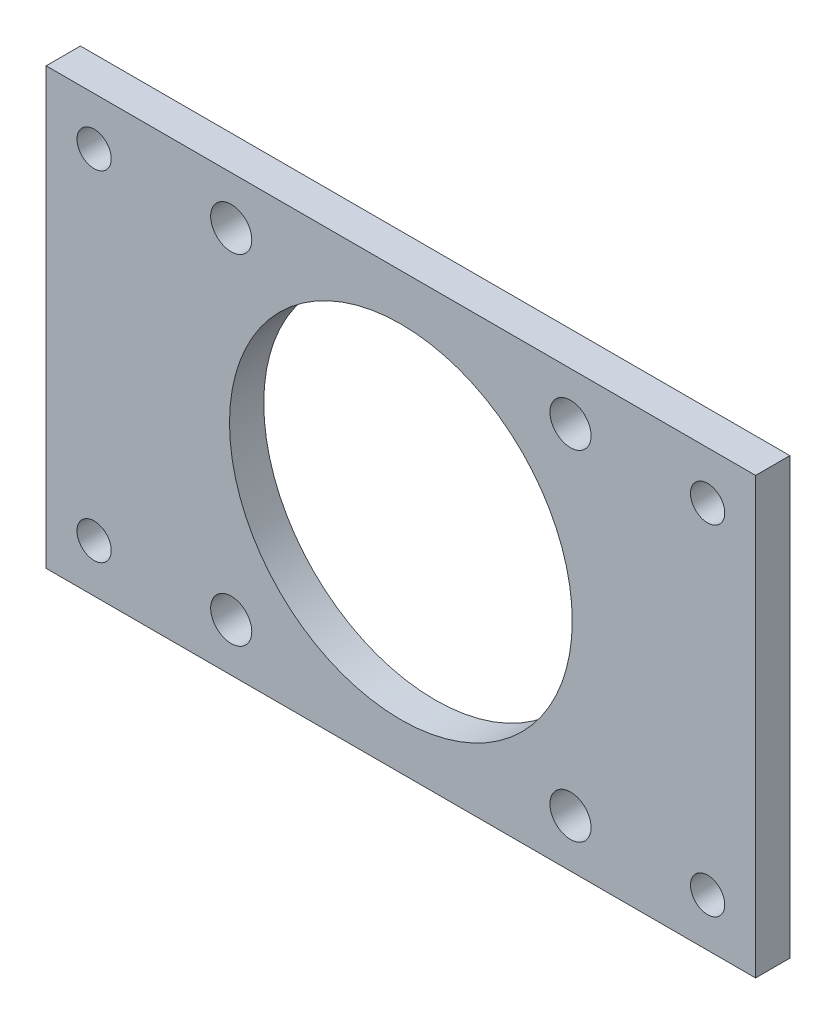
ISO-10303-21;
HEADER;
FILE_DESCRIPTION(('STEP AP214'),'2;1');
FILE_NAME('part.step','',(''),(''),'','','');
FILE_SCHEMA(('AUTOMOTIVE_DESIGN { 1 0 10303 214 1 1 1 1 }'));
ENDSEC;
DATA;
#1=APPLICATION_CONTEXT('core data for automotive mechanical design processes');
#2=APPLICATION_PROTOCOL_DEFINITION('international standard','automotive_design',2000,#1);
#3=PRODUCT_CONTEXT('',#1,'mechanical');
#4=PRODUCT('Part','Part','',(#3));
#5=PRODUCT_RELATED_PRODUCT_CATEGORY('part','',(#4));
#6=PRODUCT_DEFINITION_FORMATION('','',#4);
#7=PRODUCT_DEFINITION_CONTEXT('part definition',#1,'design');
#8=PRODUCT_DEFINITION('design','',#6,#7);
#9=PRODUCT_DEFINITION_SHAPE('','',#8);
#10=(LENGTH_UNIT() NAMED_UNIT(*) SI_UNIT(.MILLI.,.METRE.));
#11=(NAMED_UNIT(*) PLANE_ANGLE_UNIT() SI_UNIT($,.RADIAN.));
#12=(NAMED_UNIT(*) SI_UNIT($,.STERADIAN.) SOLID_ANGLE_UNIT());
#13=UNCERTAINTY_MEASURE_WITH_UNIT(LENGTH_MEASURE(1.E-05),#10,'distance_accuracy_value','');
#14=(GEOMETRIC_REPRESENTATION_CONTEXT(3) GLOBAL_UNCERTAINTY_ASSIGNED_CONTEXT((#13)) GLOBAL_UNIT_ASSIGNED_CONTEXT((#10,
#11,#12)) REPRESENTATION_CONTEXT('',''));
#15=CARTESIAN_POINT('',(0.,0.,0.));
#16=DIRECTION('',(0.,0.,1.));
#17=DIRECTION('',(1.,0.,0.));
#18=AXIS2_PLACEMENT_3D('',#15,#16,#17);
#19=CARTESIAN_POINT('',(0.,0.,5.));
#20=DIRECTION('',(0.,0.,1.));
#21=DIRECTION('',(1.,0.,0.));
#22=AXIS2_PLACEMENT_3D('',#19,#20,#21);
#23=PLANE('',#22);
#24=CARTESIAN_POINT('',(-44.7487373415291,-24.7487373415292,5.));
#25=DIRECTION('',(0.,0.,1.));
#26=DIRECTION('',(1.,0.,0.));
#27=AXIS2_PLACEMENT_3D('',#24,#25,#26);
#28=CIRCLE('',#27,2.49999999999999);
#29=CARTESIAN_POINT('',(-42.2487373415291,-24.7487373415292,5.));
#30=VERTEX_POINT('',#29);
#31=EDGE_CURVE('E182',#30,#30,#28,.T.);
#32=ORIENTED_EDGE('',*,*,#31,.F.);
#33=EDGE_LOOP('',(#32));
#34=FACE_BOUND('',#33,.T.);
#35=CARTESIAN_POINT('',(-24.7487373415289,24.7487373415294,5.));
#36=DIRECTION('',(0.,0.,1.));
#37=DIRECTION('',(1.,0.,0.));
#38=AXIS2_PLACEMENT_3D('',#35,#36,#37);
#39=CIRCLE('',#38,3.);
#40=CARTESIAN_POINT('',(-21.7487373415289,24.7487373415294,5.));
#41=VERTEX_POINT('',#40);
#42=EDGE_CURVE('E166',#41,#41,#39,.T.);
#43=ORIENTED_EDGE('',*,*,#42,.F.);
#44=EDGE_LOOP('',(#43));
#45=FACE_BOUND('',#44,.T.);
#46=CARTESIAN_POINT('',(24.7487373415291,-24.7487373415292,5.));
#47=DIRECTION('',(0.,0.,1.));
#48=DIRECTION('',(1.,0.,0.));
#49=AXIS2_PLACEMENT_3D('',#46,#47,#48);
#50=CIRCLE('',#49,3.);
#51=CARTESIAN_POINT('',(27.7487373415291,-24.7487373415292,5.));
#52=VERTEX_POINT('',#51);
#53=EDGE_CURVE('E150',#52,#52,#50,.T.);
#54=ORIENTED_EDGE('',*,*,#53,.F.);
#55=EDGE_LOOP('',(#54));
#56=FACE_BOUND('',#55,.T.);
#57=CARTESIAN_POINT('',(24.7487373415291,24.7487373415292,5.));
#58=DIRECTION('',(0.,0.,1.));
#59=DIRECTION('',(1.,0.,0.));
#60=AXIS2_PLACEMENT_3D('',#57,#58,#59);
#61=CIRCLE('',#60,3.);
#62=CARTESIAN_POINT('',(27.7487373415291,24.7487373415292,5.));
#63=VERTEX_POINT('',#62);
#64=EDGE_CURVE('E134',#63,#63,#61,.T.);
#65=ORIENTED_EDGE('',*,*,#64,.F.);
#66=EDGE_LOOP('',(#65));
#67=FACE_BOUND('',#66,.T.);
#68=DIRECTION('',(0.,-1.,0.));
#69=VECTOR('',#68,1.);
#70=CARTESIAN_POINT('',(-51.7487373415291,31.7487373415292,5.));
#71=LINE('',#70,#69);
#72=CARTESIAN_POINT('',(-51.7487373415291,31.7487373415292,5.));
#73=VERTEX_POINT('',#72);
#74=CARTESIAN_POINT('',(-51.7487373415291,-31.7487373415292,5.));
#75=VERTEX_POINT('',#74);
#76=EDGE_CURVE('E92',#73,#75,#71,.T.);
#77=ORIENTED_EDGE('',*,*,#76,.T.);
#78=DIRECTION('',(1.,0.,0.));
#79=VECTOR('',#78,1.);
#80=CARTESIAN_POINT('',(-51.7487373415291,-31.7487373415292,5.));
#81=LINE('',#80,#79);
#82=CARTESIAN_POINT('',(51.7487373415291,-31.7487373415292,5.));
#83=VERTEX_POINT('',#82);
#84=EDGE_CURVE('E87',#75,#83,#81,.T.);
#85=ORIENTED_EDGE('',*,*,#84,.T.);
#86=DIRECTION('',(0.,1.,0.));
#87=VECTOR('',#86,1.);
#88=CARTESIAN_POINT('',(51.7487373415291,31.7487373415292,5.));
#89=LINE('',#88,#87);
#90=CARTESIAN_POINT('',(51.7487373415291,31.7487373415292,5.));
#91=VERTEX_POINT('',#90);
#92=EDGE_CURVE('E90',#83,#91,#89,.T.);
#93=ORIENTED_EDGE('',*,*,#92,.T.);
#94=DIRECTION('',(-1.,0.,0.));
#95=VECTOR('',#94,1.);
#96=CARTESIAN_POINT('',(-51.7487373415291,31.7487373415292,5.));
#97=LINE('',#96,#95);
#98=EDGE_CURVE('E57',#91,#73,#97,.T.);
#99=ORIENTED_EDGE('',*,*,#98,.T.);
#100=EDGE_LOOP('',(#77,#85,#93,#99));
#101=FACE_BOUND('',#100,.T.);
#102=CARTESIAN_POINT('',(0.,0.,5.));
#103=DIRECTION('',(0.,0.,1.));
#104=DIRECTION('',(1.,0.,0.));
#105=AXIS2_PLACEMENT_3D('',#102,#103,#104);
#106=CIRCLE('',#105,25.);
#107=CARTESIAN_POINT('',(25.,0.,5.));
#108=VERTEX_POINT('',#107);
#109=EDGE_CURVE('E112',#108,#108,#106,.T.);
#110=ORIENTED_EDGE('',*,*,#109,.F.);
#111=EDGE_LOOP('',(#110));
#112=FACE_BOUND('',#111,.T.);
#113=CARTESIAN_POINT('',(44.7487373415291,24.7487373415292,5.));
#114=DIRECTION('',(0.,0.,1.));
#115=DIRECTION('',(1.,0.,0.));
#116=AXIS2_PLACEMENT_3D('',#113,#114,#115);
#117=CIRCLE('',#116,2.49999999999999);
#118=CARTESIAN_POINT('',(47.2487373415291,24.7487373415292,5.));
#119=VERTEX_POINT('',#118);
#120=EDGE_CURVE('E142',#119,#119,#117,.T.);
#121=ORIENTED_EDGE('',*,*,#120,.F.);
#122=EDGE_LOOP('',(#121));
#123=FACE_BOUND('',#122,.T.);
#124=CARTESIAN_POINT('',(-24.7487373415277,-24.7487373415306,5.));
#125=DIRECTION('',(0.,0.,1.));
#126=DIRECTION('',(1.,0.,0.));
#127=AXIS2_PLACEMENT_3D('',#124,#125,#126);
#128=CIRCLE('',#127,3.00000000000104);
#129=CARTESIAN_POINT('',(-21.7487373415267,-24.7487373415306,5.));
#130=VERTEX_POINT('',#129);
#131=EDGE_CURVE('E158',#130,#130,#128,.T.);
#132=ORIENTED_EDGE('',*,*,#131,.F.);
#133=EDGE_LOOP('',(#132));
#134=FACE_BOUND('',#133,.T.);
#135=CARTESIAN_POINT('',(44.7487373415291,-24.7487373415292,5.));
#136=DIRECTION('',(0.,0.,1.));
#137=DIRECTION('',(-1.,0.,0.));
#138=AXIS2_PLACEMENT_3D('',#135,#136,#137);
#139=CIRCLE('',#138,2.49999999999999);
#140=CARTESIAN_POINT('',(42.2487373415291,-24.7487373415292,5.));
#141=VERTEX_POINT('',#140);
#142=EDGE_CURVE('E174',#141,#141,#139,.T.);
#143=ORIENTED_EDGE('',*,*,#142,.F.);
#144=EDGE_LOOP('',(#143));
#145=FACE_BOUND('',#144,.T.);
#146=CARTESIAN_POINT('',(-44.7487373415291,24.7487373415292,5.));
#147=DIRECTION('',(0.,0.,1.));
#148=DIRECTION('',(-1.,0.,0.));
#149=AXIS2_PLACEMENT_3D('',#146,#147,#148);
#150=CIRCLE('',#149,2.49999999999999);
#151=CARTESIAN_POINT('',(-47.2487373415291,24.7487373415292,5.));
#152=VERTEX_POINT('',#151);
#153=EDGE_CURVE('E190',#152,#152,#150,.T.);
#154=ORIENTED_EDGE('',*,*,#153,.F.);
#155=EDGE_LOOP('',(#154));
#156=FACE_BOUND('',#155,.T.);
#157=ADVANCED_FACE('F39',(#34,#45,#56,#67,#101,#112,#123,#134,#145,#156),#23,.T.);
#158=CARTESIAN_POINT('',(0.,0.,0.));
#159=DIRECTION('',(0.,0.,1.));
#160=DIRECTION('',(1.,0.,0.));
#161=AXIS2_PLACEMENT_3D('',#158,#159,#160);
#162=PLANE('',#161);
#163=DIRECTION('',(0.,-1.,0.));
#164=VECTOR('',#163,1.);
#165=CARTESIAN_POINT('',(-51.7487373415291,31.7487373415292,0.));
#166=LINE('',#165,#164);
#167=CARTESIAN_POINT('',(-51.7487373415291,31.7487373415292,0.));
#168=VERTEX_POINT('',#167);
#169=CARTESIAN_POINT('',(-51.7487373415291,-31.7487373415292,0.));
#170=VERTEX_POINT('',#169);
#171=EDGE_CURVE('E108',#168,#170,#166,.T.);
#172=ORIENTED_EDGE('',*,*,#171,.F.);
#173=DIRECTION('',(-1.,0.,0.));
#174=VECTOR('',#173,1.);
#175=CARTESIAN_POINT('',(-51.7487373415291,31.7487373415292,0.));
#176=LINE('',#175,#174);
#177=CARTESIAN_POINT('',(51.7487373415291,31.7487373415292,0.));
#178=VERTEX_POINT('',#177);
#179=EDGE_CURVE('E80',#178,#168,#176,.T.);
#180=ORIENTED_EDGE('',*,*,#179,.F.);
#181=DIRECTION('',(0.,1.,0.));
#182=VECTOR('',#181,1.);
#183=CARTESIAN_POINT('',(51.7487373415291,31.7487373415292,0.));
#184=LINE('',#183,#182);
#185=CARTESIAN_POINT('',(51.7487373415291,-31.7487373415292,0.));
#186=VERTEX_POINT('',#185);
#187=EDGE_CURVE('E74',#186,#178,#184,.T.);
#188=ORIENTED_EDGE('',*,*,#187,.F.);
#189=DIRECTION('',(1.,0.,0.));
#190=VECTOR('',#189,1.);
#191=CARTESIAN_POINT('',(-51.7487373415291,-31.7487373415292,0.));
#192=LINE('',#191,#190);
#193=EDGE_CURVE('E97',#170,#186,#192,.T.);
#194=ORIENTED_EDGE('',*,*,#193,.F.);
#195=EDGE_LOOP('',(#172,#180,#188,#194));
#196=FACE_BOUND('',#195,.T.);
#197=CARTESIAN_POINT('',(0.,0.,0.));
#198=DIRECTION('',(0.,0.,1.));
#199=DIRECTION('',(1.,0.,0.));
#200=AXIS2_PLACEMENT_3D('',#197,#198,#199);
#201=CIRCLE('',#200,25.);
#202=CARTESIAN_POINT('',(25.,0.,0.));
#203=VERTEX_POINT('',#202);
#204=EDGE_CURVE('E130',#203,#203,#201,.T.);
#205=ORIENTED_EDGE('',*,*,#204,.T.);
#206=EDGE_LOOP('',(#205));
#207=FACE_BOUND('',#206,.T.);
#208=CARTESIAN_POINT('',(24.7487373415291,24.7487373415292,0.));
#209=DIRECTION('',(0.,0.,1.));
#210=DIRECTION('',(1.,0.,0.));
#211=AXIS2_PLACEMENT_3D('',#208,#209,#210);
#212=CIRCLE('',#211,3.);
#213=CARTESIAN_POINT('',(27.7487373415291,24.7487373415292,0.));
#214=VERTEX_POINT('',#213);
#215=EDGE_CURVE('E138',#214,#214,#212,.T.);
#216=ORIENTED_EDGE('',*,*,#215,.T.);
#217=EDGE_LOOP('',(#216));
#218=FACE_BOUND('',#217,.T.);
#219=CARTESIAN_POINT('',(44.7487373415291,24.7487373415292,0.));
#220=DIRECTION('',(0.,0.,1.));
#221=DIRECTION('',(1.,0.,0.));
#222=AXIS2_PLACEMENT_3D('',#219,#220,#221);
#223=CIRCLE('',#222,2.49999999999999);
#224=CARTESIAN_POINT('',(47.2487373415291,24.7487373415292,0.));
#225=VERTEX_POINT('',#224);
#226=EDGE_CURVE('E146',#225,#225,#223,.T.);
#227=ORIENTED_EDGE('',*,*,#226,.T.);
#228=EDGE_LOOP('',(#227));
#229=FACE_BOUND('',#228,.T.);
#230=CARTESIAN_POINT('',(24.7487373415291,-24.7487373415292,0.));
#231=DIRECTION('',(0.,0.,1.));
#232=DIRECTION('',(1.,0.,0.));
#233=AXIS2_PLACEMENT_3D('',#230,#231,#232);
#234=CIRCLE('',#233,3.);
#235=CARTESIAN_POINT('',(27.7487373415291,-24.7487373415292,0.));
#236=VERTEX_POINT('',#235);
#237=EDGE_CURVE('E154',#236,#236,#234,.T.);
#238=ORIENTED_EDGE('',*,*,#237,.T.);
#239=EDGE_LOOP('',(#238));
#240=FACE_BOUND('',#239,.T.);
#241=CARTESIAN_POINT('',(-24.7487373415277,-24.7487373415306,0.));
#242=DIRECTION('',(0.,0.,1.));
#243=DIRECTION('',(1.,0.,0.));
#244=AXIS2_PLACEMENT_3D('',#241,#242,#243);
#245=CIRCLE('',#244,3.00000000000104);
#246=CARTESIAN_POINT('',(-21.7487373415267,-24.7487373415306,0.));
#247=VERTEX_POINT('',#246);
#248=EDGE_CURVE('E162',#247,#247,#245,.T.);
#249=ORIENTED_EDGE('',*,*,#248,.T.);
#250=EDGE_LOOP('',(#249));
#251=FACE_BOUND('',#250,.T.);
#252=CARTESIAN_POINT('',(-24.7487373415289,24.7487373415294,0.));
#253=DIRECTION('',(0.,0.,1.));
#254=DIRECTION('',(1.,0.,0.));
#255=AXIS2_PLACEMENT_3D('',#252,#253,#254);
#256=CIRCLE('',#255,3.);
#257=CARTESIAN_POINT('',(-21.7487373415289,24.7487373415294,0.));
#258=VERTEX_POINT('',#257);
#259=EDGE_CURVE('E170',#258,#258,#256,.T.);
#260=ORIENTED_EDGE('',*,*,#259,.T.);
#261=EDGE_LOOP('',(#260));
#262=FACE_BOUND('',#261,.T.);
#263=CARTESIAN_POINT('',(44.7487373415291,-24.7487373415292,0.));
#264=DIRECTION('',(0.,0.,1.));
#265=DIRECTION('',(-1.,0.,0.));
#266=AXIS2_PLACEMENT_3D('',#263,#264,#265);
#267=CIRCLE('',#266,2.49999999999999);
#268=CARTESIAN_POINT('',(42.2487373415291,-24.7487373415292,0.));
#269=VERTEX_POINT('',#268);
#270=EDGE_CURVE('E178',#269,#269,#267,.T.);
#271=ORIENTED_EDGE('',*,*,#270,.T.);
#272=EDGE_LOOP('',(#271));
#273=FACE_BOUND('',#272,.T.);
#274=CARTESIAN_POINT('',(-44.7487373415291,-24.7487373415292,0.));
#275=DIRECTION('',(0.,0.,1.));
#276=DIRECTION('',(1.,0.,0.));
#277=AXIS2_PLACEMENT_3D('',#274,#275,#276);
#278=CIRCLE('',#277,2.49999999999999);
#279=CARTESIAN_POINT('',(-42.2487373415291,-24.7487373415292,0.));
#280=VERTEX_POINT('',#279);
#281=EDGE_CURVE('E186',#280,#280,#278,.T.);
#282=ORIENTED_EDGE('',*,*,#281,.T.);
#283=EDGE_LOOP('',(#282));
#284=FACE_BOUND('',#283,.T.);
#285=CARTESIAN_POINT('',(-44.7487373415291,24.7487373415292,0.));
#286=DIRECTION('',(0.,0.,1.));
#287=DIRECTION('',(-1.,0.,0.));
#288=AXIS2_PLACEMENT_3D('',#285,#286,#287);
#289=CIRCLE('',#288,2.49999999999999);
#290=CARTESIAN_POINT('',(-47.2487373415291,24.7487373415292,0.));
#291=VERTEX_POINT('',#290);
#292=EDGE_CURVE('E194',#291,#291,#289,.T.);
#293=ORIENTED_EDGE('',*,*,#292,.T.);
#294=EDGE_LOOP('',(#293));
#295=FACE_BOUND('',#294,.T.);
#296=ADVANCED_FACE('F125',(#196,#207,#218,#229,#240,#251,#262,#273,#284,#295),#162,.F.);
#297=CARTESIAN_POINT('',(-51.7487373415291,31.7487373415292,5.));
#298=DIRECTION('',(1.,0.,0.));
#299=DIRECTION('',(0.,1.,0.));
#300=AXIS2_PLACEMENT_3D('',#297,#298,#299);
#301=PLANE('',#300);
#302=ORIENTED_EDGE('',*,*,#171,.T.);
#303=DIRECTION('',(0.,0.,-1.));
#304=VECTOR('',#303,1.);
#305=CARTESIAN_POINT('',(-51.7487373415291,-31.7487373415292,5.));
#306=LINE('',#305,#304);
#307=EDGE_CURVE('E11',#75,#170,#306,.T.);
#308=ORIENTED_EDGE('',*,*,#307,.F.);
#309=ORIENTED_EDGE('',*,*,#76,.F.);
#310=DIRECTION('',(0.,0.,-1.));
#311=VECTOR('',#310,1.);
#312=CARTESIAN_POINT('',(-51.7487373415291,31.7487373415292,5.));
#313=LINE('',#312,#311);
#314=EDGE_CURVE('E104',#73,#168,#313,.T.);
#315=ORIENTED_EDGE('',*,*,#314,.T.);
#316=EDGE_LOOP('',(#302,#308,#309,#315));
#317=FACE_BOUND('',#316,.T.);
#318=ADVANCED_FACE('F41',(#317),#301,.F.);
#319=CARTESIAN_POINT('',(-51.7487373415291,-31.7487373415292,5.));
#320=DIRECTION('',(0.,1.,0.));
#321=DIRECTION('',(0.,0.,1.));
#322=AXIS2_PLACEMENT_3D('',#319,#320,#321);
#323=PLANE('',#322);
#324=ORIENTED_EDGE('',*,*,#193,.T.);
#325=DIRECTION('',(0.,0.,-1.));
#326=VECTOR('',#325,1.);
#327=CARTESIAN_POINT('',(51.7487373415291,-31.7487373415292,5.));
#328=LINE('',#327,#326);
#329=EDGE_CURVE('E49',#83,#186,#328,.T.);
#330=ORIENTED_EDGE('',*,*,#329,.F.);
#331=ORIENTED_EDGE('',*,*,#84,.F.);
#332=ORIENTED_EDGE('',*,*,#307,.T.);
#333=EDGE_LOOP('',(#324,#330,#331,#332));
#334=FACE_BOUND('',#333,.T.);
#335=ADVANCED_FACE('F96',(#334),#323,.F.);
#336=CARTESIAN_POINT('',(51.7487373415291,31.7487373415292,5.));
#337=DIRECTION('',(-1.,0.,0.));
#338=DIRECTION('',(0.,-1.,0.));
#339=AXIS2_PLACEMENT_3D('',#336,#337,#338);
#340=PLANE('',#339);
#341=ORIENTED_EDGE('',*,*,#187,.T.);
#342=DIRECTION('',(0.,0.,-1.));
#343=VECTOR('',#342,1.);
#344=CARTESIAN_POINT('',(51.7487373415291,31.7487373415292,5.));
#345=LINE('',#344,#343);
#346=EDGE_CURVE('E99',#91,#178,#345,.T.);
#347=ORIENTED_EDGE('',*,*,#346,.F.);
#348=ORIENTED_EDGE('',*,*,#92,.F.);
#349=ORIENTED_EDGE('',*,*,#329,.T.);
#350=EDGE_LOOP('',(#341,#347,#348,#349));
#351=FACE_BOUND('',#350,.T.);
#352=ADVANCED_FACE('F100',(#351),#340,.F.);
#353=CARTESIAN_POINT('',(-51.7487373415291,31.7487373415292,5.));
#354=DIRECTION('',(0.,-1.,0.));
#355=DIRECTION('',(0.,0.,-1.));
#356=AXIS2_PLACEMENT_3D('',#353,#354,#355);
#357=PLANE('',#356);
#358=ORIENTED_EDGE('',*,*,#179,.T.);
#359=ORIENTED_EDGE('',*,*,#314,.F.);
#360=ORIENTED_EDGE('',*,*,#98,.F.);
#361=ORIENTED_EDGE('',*,*,#346,.T.);
#362=EDGE_LOOP('',(#358,#359,#360,#361));
#363=FACE_BOUND('',#362,.T.);
#364=ADVANCED_FACE('F122',(#363),#357,.F.);
#365=CARTESIAN_POINT('',(0.,0.,5.));
#366=DIRECTION('',(0.,0.,-1.));
#367=DIRECTION('',(-1.,0.,0.));
#368=AXIS2_PLACEMENT_3D('',#365,#366,#367);
#369=CYLINDRICAL_SURFACE('',#368,25.);
#370=ORIENTED_EDGE('',*,*,#109,.T.);
#371=EDGE_LOOP('',(#370));
#372=FACE_BOUND('',#371,.T.);
#373=ORIENTED_EDGE('',*,*,#204,.F.);
#374=EDGE_LOOP('',(#373));
#375=FACE_BOUND('',#374,.T.);
#376=ADVANCED_FACE('F215',(#372,#375),#369,.F.);
#377=CARTESIAN_POINT('',(24.7487373415291,24.7487373415292,5.));
#378=DIRECTION('',(0.,0.,-1.));
#379=DIRECTION('',(-1.,0.,0.));
#380=AXIS2_PLACEMENT_3D('',#377,#378,#379);
#381=CYLINDRICAL_SURFACE('',#380,3.);
#382=ORIENTED_EDGE('',*,*,#64,.T.);
#383=EDGE_LOOP('',(#382));
#384=FACE_BOUND('',#383,.T.);
#385=ORIENTED_EDGE('',*,*,#215,.F.);
#386=EDGE_LOOP('',(#385));
#387=FACE_BOUND('',#386,.T.);
#388=ADVANCED_FACE('F261',(#384,#387),#381,.F.);
#389=CARTESIAN_POINT('',(44.7487373415291,24.7487373415292,5.));
#390=DIRECTION('',(0.,0.,-1.));
#391=DIRECTION('',(-1.,0.,0.));
#392=AXIS2_PLACEMENT_3D('',#389,#390,#391);
#393=CYLINDRICAL_SURFACE('',#392,2.49999999999999);
#394=ORIENTED_EDGE('',*,*,#120,.T.);
#395=EDGE_LOOP('',(#394));
#396=FACE_BOUND('',#395,.T.);
#397=ORIENTED_EDGE('',*,*,#226,.F.);
#398=EDGE_LOOP('',(#397));
#399=FACE_BOUND('',#398,.T.);
#400=ADVANCED_FACE('F269',(#396,#399),#393,.F.);
#401=CARTESIAN_POINT('',(24.7487373415291,-24.7487373415292,5.));
#402=DIRECTION('',(0.,0.,-1.));
#403=DIRECTION('',(-1.,0.,0.));
#404=AXIS2_PLACEMENT_3D('',#401,#402,#403);
#405=CYLINDRICAL_SURFACE('',#404,3.);
#406=ORIENTED_EDGE('',*,*,#53,.T.);
#407=EDGE_LOOP('',(#406));
#408=FACE_BOUND('',#407,.T.);
#409=ORIENTED_EDGE('',*,*,#237,.F.);
#410=EDGE_LOOP('',(#409));
#411=FACE_BOUND('',#410,.T.);
#412=ADVANCED_FACE('F277',(#408,#411),#405,.F.);
#413=CARTESIAN_POINT('',(-24.7487373415277,-24.7487373415306,5.));
#414=DIRECTION('',(0.,0.,-1.));
#415=DIRECTION('',(-1.,0.,0.));
#416=AXIS2_PLACEMENT_3D('',#413,#414,#415);
#417=CYLINDRICAL_SURFACE('',#416,3.00000000000104);
#418=ORIENTED_EDGE('',*,*,#131,.T.);
#419=EDGE_LOOP('',(#418));
#420=FACE_BOUND('',#419,.T.);
#421=ORIENTED_EDGE('',*,*,#248,.F.);
#422=EDGE_LOOP('',(#421));
#423=FACE_BOUND('',#422,.T.);
#424=ADVANCED_FACE('F286',(#420,#423),#417,.F.);
#425=CARTESIAN_POINT('',(-24.7487373415289,24.7487373415294,5.));
#426=DIRECTION('',(0.,0.,-1.));
#427=DIRECTION('',(-1.,0.,0.));
#428=AXIS2_PLACEMENT_3D('',#425,#426,#427);
#429=CYLINDRICAL_SURFACE('',#428,3.);
#430=ORIENTED_EDGE('',*,*,#42,.T.);
#431=EDGE_LOOP('',(#430));
#432=FACE_BOUND('',#431,.T.);
#433=ORIENTED_EDGE('',*,*,#259,.F.);
#434=EDGE_LOOP('',(#433));
#435=FACE_BOUND('',#434,.T.);
#436=ADVANCED_FACE('F295',(#432,#435),#429,.F.);
#437=CARTESIAN_POINT('',(44.7487373415291,-24.7487373415292,5.));
#438=DIRECTION('',(0.,0.,-1.));
#439=DIRECTION('',(-1.,0.,0.));
#440=AXIS2_PLACEMENT_3D('',#437,#438,#439);
#441=CYLINDRICAL_SURFACE('',#440,2.49999999999999);
#442=ORIENTED_EDGE('',*,*,#142,.T.);
#443=EDGE_LOOP('',(#442));
#444=FACE_BOUND('',#443,.T.);
#445=ORIENTED_EDGE('',*,*,#270,.F.);
#446=EDGE_LOOP('',(#445));
#447=FACE_BOUND('',#446,.T.);
#448=ADVANCED_FACE('F304',(#444,#447),#441,.F.);
#449=CARTESIAN_POINT('',(-44.7487373415291,-24.7487373415292,5.));
#450=DIRECTION('',(0.,0.,-1.));
#451=DIRECTION('',(-1.,0.,0.));
#452=AXIS2_PLACEMENT_3D('',#449,#450,#451);
#453=CYLINDRICAL_SURFACE('',#452,2.49999999999999);
#454=ORIENTED_EDGE('',*,*,#31,.T.);
#455=EDGE_LOOP('',(#454));
#456=FACE_BOUND('',#455,.T.);
#457=ORIENTED_EDGE('',*,*,#281,.F.);
#458=EDGE_LOOP('',(#457));
#459=FACE_BOUND('',#458,.T.);
#460=ADVANCED_FACE('F313',(#456,#459),#453,.F.);
#461=CARTESIAN_POINT('',(-44.7487373415291,24.7487373415292,5.));
#462=DIRECTION('',(0.,0.,-1.));
#463=DIRECTION('',(-1.,0.,0.));
#464=AXIS2_PLACEMENT_3D('',#461,#462,#463);
#465=CYLINDRICAL_SURFACE('',#464,2.49999999999999);
#466=ORIENTED_EDGE('',*,*,#153,.T.);
#467=EDGE_LOOP('',(#466));
#468=FACE_BOUND('',#467,.T.);
#469=ORIENTED_EDGE('',*,*,#292,.F.);
#470=EDGE_LOOP('',(#469));
#471=FACE_BOUND('',#470,.T.);
#472=ADVANCED_FACE('F202',(#468,#471),#465,.F.);
#473=CLOSED_SHELL('',(#157,#296,#318,#335,#352,#364,#376,#388,#400,#412,#424,#436,#448,#460,#472));
#474=MANIFOLD_SOLID_BREP('B2',#473);
#475=ADVANCED_BREP_SHAPE_REPRESENTATION('',(#18,#474),#14);
#476=SHAPE_DEFINITION_REPRESENTATION(#9,#475);
ENDSEC;
END-ISO-10303-21;
